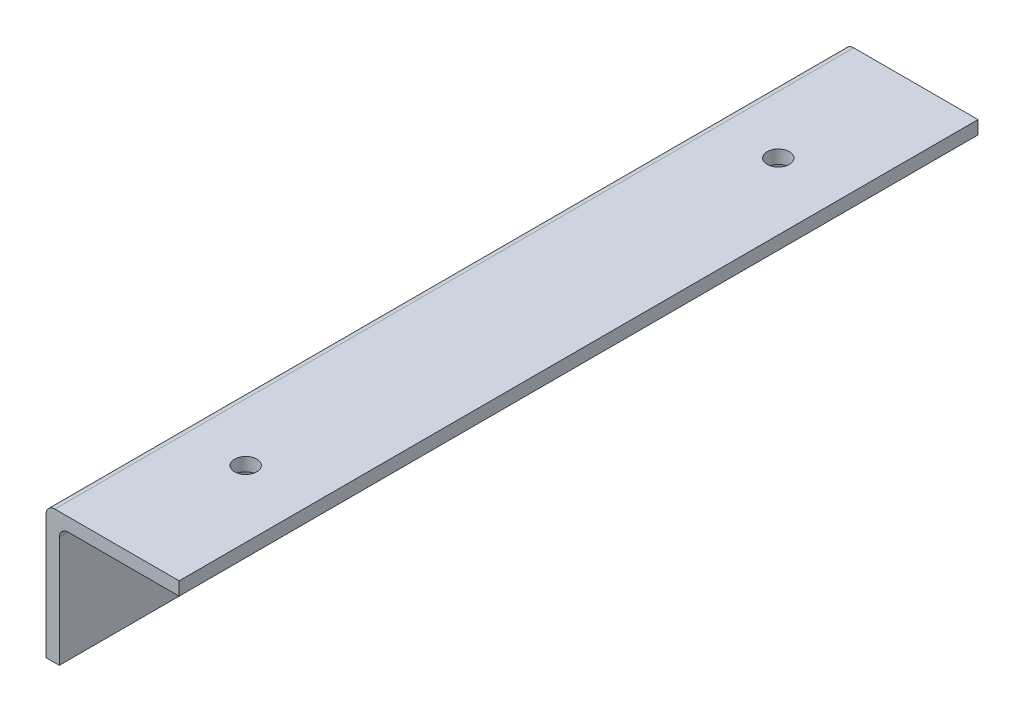
ISO-10303-21;
HEADER;
FILE_DESCRIPTION(('STEP AP214'),'2;1');
FILE_NAME('part.step','',(''),(''),'','','');
FILE_SCHEMA(('AUTOMOTIVE_DESIGN { 1 0 10303 214 1 1 1 1 }'));
ENDSEC;
DATA;
#1=APPLICATION_CONTEXT('core data for automotive mechanical design processes');
#2=APPLICATION_PROTOCOL_DEFINITION('international standard','automotive_design',2000,#1);
#3=PRODUCT_CONTEXT('',#1,'mechanical');
#4=PRODUCT('Part','Part','',(#3));
#5=PRODUCT_RELATED_PRODUCT_CATEGORY('part','',(#4));
#6=PRODUCT_DEFINITION_FORMATION('','',#4);
#7=PRODUCT_DEFINITION_CONTEXT('part definition',#1,'design');
#8=PRODUCT_DEFINITION('design','',#6,#7);
#9=PRODUCT_DEFINITION_SHAPE('','',#8);
#10=(LENGTH_UNIT() NAMED_UNIT(*) SI_UNIT(.MILLI.,.METRE.));
#11=(NAMED_UNIT(*) PLANE_ANGLE_UNIT() SI_UNIT($,.RADIAN.));
#12=(NAMED_UNIT(*) SI_UNIT($,.STERADIAN.) SOLID_ANGLE_UNIT());
#13=UNCERTAINTY_MEASURE_WITH_UNIT(LENGTH_MEASURE(1.E-05),#10,'distance_accuracy_value','');
#14=(GEOMETRIC_REPRESENTATION_CONTEXT(3) GLOBAL_UNCERTAINTY_ASSIGNED_CONTEXT((#13)) GLOBAL_UNIT_ASSIGNED_CONTEXT((#10,
#11,#12)) REPRESENTATION_CONTEXT('',''));
#15=CARTESIAN_POINT('',(0.,0.,0.));
#16=DIRECTION('',(0.,0.,1.));
#17=DIRECTION('',(1.,0.,0.));
#18=AXIS2_PLACEMENT_3D('',#15,#16,#17);
#19=CARTESIAN_POINT('',(30.,0.,180.));
#20=DIRECTION('',(0.,-1.,0.));
#21=DIRECTION('',(1.,0.,0.));
#22=AXIS2_PLACEMENT_3D('',#19,#20,#21);
#23=PLANE('',#22);
#24=CARTESIAN_POINT('',(15.,0.,30.));
#25=DIRECTION('',(0.,-1.,0.));
#26=DIRECTION('',(1.,0.,0.));
#27=AXIS2_PLACEMENT_3D('',#24,#25,#26);
#28=CIRCLE('',#27,2.50000000000001);
#29=CARTESIAN_POINT('',(17.5,0.,30.));
#30=VERTEX_POINT('',#29);
#31=EDGE_CURVE('E232',#30,#30,#28,.T.);
#32=ORIENTED_EDGE('',*,*,#31,.T.);
#33=EDGE_LOOP('',(#32));
#34=FACE_BOUND('',#33,.T.);
#35=CARTESIAN_POINT('',(15.,0.,150.));
#36=DIRECTION('',(0.,-1.,0.));
#37=DIRECTION('',(1.,0.,0.));
#38=AXIS2_PLACEMENT_3D('',#35,#36,#37);
#39=CIRCLE('',#38,2.5);
#40=CARTESIAN_POINT('',(17.5,0.,150.));
#41=VERTEX_POINT('',#40);
#42=EDGE_CURVE('E236',#41,#41,#39,.T.);
#43=ORIENTED_EDGE('',*,*,#42,.T.);
#44=EDGE_LOOP('',(#43));
#45=FACE_BOUND('',#44,.T.);
#46=DIRECTION('',(-1.,0.,0.));
#47=VECTOR('',#46,1.);
#48=CARTESIAN_POINT('',(30.,0.,0.));
#49=LINE('',#48,#47);
#50=CARTESIAN_POINT('',(30.,0.,0.));
#51=VERTEX_POINT('',#50);
#52=CARTESIAN_POINT('',(2.,0.,0.));
#53=VERTEX_POINT('',#52);
#54=EDGE_CURVE('E134',#51,#53,#49,.T.);
#55=ORIENTED_EDGE('',*,*,#54,.T.);
#56=DIRECTION('',(0.,0.,-1.));
#57=VECTOR('',#56,1.);
#58=CARTESIAN_POINT('',(2.,0.,180.));
#59=LINE('',#58,#57);
#60=CARTESIAN_POINT('',(2.,0.,180.));
#61=VERTEX_POINT('',#60);
#62=EDGE_CURVE('E48',#53,#61,#59,.F.);
#63=ORIENTED_EDGE('',*,*,#62,.T.);
#64=DIRECTION('',(-1.,0.,0.));
#65=VECTOR('',#64,1.);
#66=CARTESIAN_POINT('',(30.,0.,180.));
#67=LINE('',#66,#65);
#68=CARTESIAN_POINT('',(30.,0.,180.));
#69=VERTEX_POINT('',#68);
#70=EDGE_CURVE('E110',#69,#61,#67,.T.);
#71=ORIENTED_EDGE('',*,*,#70,.F.);
#72=DIRECTION('',(0.,0.,-1.));
#73=VECTOR('',#72,1.);
#74=CARTESIAN_POINT('',(30.,0.,180.));
#75=LINE('',#74,#73);
#76=EDGE_CURVE('E133',#69,#51,#75,.T.);
#77=ORIENTED_EDGE('',*,*,#76,.T.);
#78=EDGE_LOOP('',(#55,#63,#71,#77));
#79=FACE_BOUND('',#78,.T.);
#80=ADVANCED_FACE('F33',(#34,#45,#79),#23,.F.);
#81=CARTESIAN_POINT('',(0.,0.,180.));
#82=DIRECTION('',(1.,0.,0.));
#83=DIRECTION('',(0.,0.,-1.));
#84=AXIS2_PLACEMENT_3D('',#81,#82,#83);
#85=PLANE('',#84);
#86=CARTESIAN_POINT('',(0.,-15.,150.));
#87=DIRECTION('',(1.,0.,0.));
#88=DIRECTION('',(0.,0.,-1.));
#89=AXIS2_PLACEMENT_3D('',#86,#87,#88);
#90=CIRCLE('',#89,2.99999999999999);
#91=CARTESIAN_POINT('',(0.,-15.,147.));
#92=VERTEX_POINT('',#91);
#93=EDGE_CURVE('E245',#92,#92,#90,.T.);
#94=ORIENTED_EDGE('',*,*,#93,.T.);
#95=EDGE_LOOP('',(#94));
#96=FACE_BOUND('',#95,.T.);
#97=CARTESIAN_POINT('',(0.,-15.,30.));
#98=DIRECTION('',(1.,0.,0.));
#99=DIRECTION('',(0.,0.,-1.));
#100=AXIS2_PLACEMENT_3D('',#97,#98,#99);
#101=CIRCLE('',#100,3.);
#102=CARTESIAN_POINT('',(0.,-15.,27.));
#103=VERTEX_POINT('',#102);
#104=EDGE_CURVE('E136',#103,#103,#101,.T.);
#105=ORIENTED_EDGE('',*,*,#104,.T.);
#106=EDGE_LOOP('',(#105));
#107=FACE_BOUND('',#106,.T.);
#108=DIRECTION('',(0.,-1.,0.));
#109=VECTOR('',#108,1.);
#110=CARTESIAN_POINT('',(0.,0.,180.));
#111=LINE('',#110,#109);
#112=CARTESIAN_POINT('',(0.,-2.,180.));
#113=VERTEX_POINT('',#112);
#114=CARTESIAN_POINT('',(0.,-30.,180.));
#115=VERTEX_POINT('',#114);
#116=EDGE_CURVE('E98',#113,#115,#111,.T.);
#117=ORIENTED_EDGE('',*,*,#116,.F.);
#118=DIRECTION('',(0.,0.,-1.));
#119=VECTOR('',#118,1.);
#120=CARTESIAN_POINT('',(0.,-2.,180.));
#121=LINE('',#120,#119);
#122=CARTESIAN_POINT('',(0.,-2.,0.));
#123=VERTEX_POINT('',#122);
#124=EDGE_CURVE('E157',#113,#123,#121,.T.);
#125=ORIENTED_EDGE('',*,*,#124,.T.);
#126=DIRECTION('',(0.,-1.,0.));
#127=VECTOR('',#126,1.);
#128=CARTESIAN_POINT('',(0.,0.,0.));
#129=LINE('',#128,#127);
#130=CARTESIAN_POINT('',(0.,-30.,0.));
#131=VERTEX_POINT('',#130);
#132=EDGE_CURVE('E115',#123,#131,#129,.T.);
#133=ORIENTED_EDGE('',*,*,#132,.T.);
#134=DIRECTION('',(0.,0.,-1.));
#135=VECTOR('',#134,1.);
#136=CARTESIAN_POINT('',(0.,-30.,180.));
#137=LINE('',#136,#135);
#138=EDGE_CURVE('E113',#115,#131,#137,.T.);
#139=ORIENTED_EDGE('',*,*,#138,.F.);
#140=EDGE_LOOP('',(#117,#125,#133,#139));
#141=FACE_BOUND('',#140,.T.);
#142=ADVANCED_FACE('F114',(#96,#107,#141),#85,.F.);
#143=CARTESIAN_POINT('',(0.,-30.,180.));
#144=DIRECTION('',(0.,1.,0.));
#145=DIRECTION('',(0.,0.,1.));
#146=AXIS2_PLACEMENT_3D('',#143,#144,#145);
#147=PLANE('',#146);
#148=DIRECTION('',(1.,0.,0.));
#149=VECTOR('',#148,1.);
#150=CARTESIAN_POINT('',(0.,-30.,0.));
#151=LINE('',#150,#149);
#152=CARTESIAN_POINT('',(3.,-30.,0.));
#153=VERTEX_POINT('',#152);
#154=EDGE_CURVE('E138',#131,#153,#151,.T.);
#155=ORIENTED_EDGE('',*,*,#154,.T.);
#156=DIRECTION('',(0.,0.,-1.));
#157=VECTOR('',#156,1.);
#158=CARTESIAN_POINT('',(3.,-30.,180.));
#159=LINE('',#158,#157);
#160=CARTESIAN_POINT('',(3.,-30.,180.));
#161=VERTEX_POINT('',#160);
#162=EDGE_CURVE('E119',#161,#153,#159,.T.);
#163=ORIENTED_EDGE('',*,*,#162,.F.);
#164=DIRECTION('',(1.,0.,0.));
#165=VECTOR('',#164,1.);
#166=CARTESIAN_POINT('',(0.,-30.,180.));
#167=LINE('',#166,#165);
#168=EDGE_CURVE('E103',#115,#161,#167,.T.);
#169=ORIENTED_EDGE('',*,*,#168,.F.);
#170=ORIENTED_EDGE('',*,*,#138,.T.);
#171=EDGE_LOOP('',(#155,#163,#169,#170));
#172=FACE_BOUND('',#171,.T.);
#173=ADVANCED_FACE('F121',(#172),#147,.F.);
#174=CARTESIAN_POINT('',(3.,-30.,180.));
#175=DIRECTION('',(-1.,0.,0.));
#176=DIRECTION('',(0.,0.,1.));
#177=AXIS2_PLACEMENT_3D('',#174,#175,#176);
#178=PLANE('',#177);
#179=CARTESIAN_POINT('',(3.,-15.,150.));
#180=DIRECTION('',(1.,0.,0.));
#181=DIRECTION('',(0.,0.,-1.));
#182=AXIS2_PLACEMENT_3D('',#179,#180,#181);
#183=CIRCLE('',#182,2.99999999999999);
#184=CARTESIAN_POINT('',(3.00000000000003,-15.,147.));
#185=VERTEX_POINT('',#184);
#186=EDGE_CURVE('E242',#185,#185,#183,.T.);
#187=ORIENTED_EDGE('',*,*,#186,.F.);
#188=EDGE_LOOP('',(#187));
#189=FACE_BOUND('',#188,.T.);
#190=CARTESIAN_POINT('',(3.,-15.,30.));
#191=DIRECTION('',(1.,0.,0.));
#192=DIRECTION('',(0.,0.,-1.));
#193=AXIS2_PLACEMENT_3D('',#190,#191,#192);
#194=CIRCLE('',#193,3.);
#195=CARTESIAN_POINT('',(3.00000000000003,-15.,27.));
#196=VERTEX_POINT('',#195);
#197=EDGE_CURVE('E248',#196,#196,#194,.T.);
#198=ORIENTED_EDGE('',*,*,#197,.F.);
#199=EDGE_LOOP('',(#198));
#200=FACE_BOUND('',#199,.T.);
#201=DIRECTION('',(0.,1.,0.));
#202=VECTOR('',#201,1.);
#203=CARTESIAN_POINT('',(3.,-30.,0.));
#204=LINE('',#203,#202);
#205=CARTESIAN_POINT('',(3.,-5.,0.));
#206=VERTEX_POINT('',#205);
#207=EDGE_CURVE('E140',#153,#206,#204,.T.);
#208=ORIENTED_EDGE('',*,*,#207,.T.);
#209=DIRECTION('',(0.,0.,-1.));
#210=VECTOR('',#209,1.);
#211=CARTESIAN_POINT('',(3.,-5.,180.));
#212=LINE('',#211,#210);
#213=CARTESIAN_POINT('',(3.,-5.,180.));
#214=VERTEX_POINT('',#213);
#215=EDGE_CURVE('E155',#206,#214,#212,.F.);
#216=ORIENTED_EDGE('',*,*,#215,.T.);
#217=DIRECTION('',(0.,1.,0.));
#218=VECTOR('',#217,1.);
#219=CARTESIAN_POINT('',(3.,-30.,180.));
#220=LINE('',#219,#218);
#221=EDGE_CURVE('E124',#161,#214,#220,.T.);
#222=ORIENTED_EDGE('',*,*,#221,.F.);
#223=ORIENTED_EDGE('',*,*,#162,.T.);
#224=EDGE_LOOP('',(#208,#216,#222,#223));
#225=FACE_BOUND('',#224,.T.);
#226=ADVANCED_FACE('F169',(#189,#200,#225),#178,.F.);
#227=CARTESIAN_POINT('',(3.,-3.,180.));
#228=DIRECTION('',(0.,1.,0.));
#229=DIRECTION('',(-1.,0.,0.));
#230=AXIS2_PLACEMENT_3D('',#227,#228,#229);
#231=PLANE('',#230);
#232=CARTESIAN_POINT('',(15.,-3.,30.));
#233=DIRECTION('',(0.,-1.,0.));
#234=DIRECTION('',(1.,0.,0.));
#235=AXIS2_PLACEMENT_3D('',#232,#233,#234);
#236=CIRCLE('',#235,2.50000000000001);
#237=CARTESIAN_POINT('',(17.5,-3.00000000000003,30.));
#238=VERTEX_POINT('',#237);
#239=EDGE_CURVE('E230',#238,#238,#236,.T.);
#240=ORIENTED_EDGE('',*,*,#239,.F.);
#241=EDGE_LOOP('',(#240));
#242=FACE_BOUND('',#241,.T.);
#243=CARTESIAN_POINT('',(15.,-3.,150.));
#244=DIRECTION('',(0.,-1.,0.));
#245=DIRECTION('',(1.,0.,0.));
#246=AXIS2_PLACEMENT_3D('',#243,#244,#245);
#247=CIRCLE('',#246,2.5);
#248=CARTESIAN_POINT('',(17.5,-3.00000000000003,150.));
#249=VERTEX_POINT('',#248);
#250=EDGE_CURVE('E233',#249,#249,#247,.T.);
#251=ORIENTED_EDGE('',*,*,#250,.F.);
#252=EDGE_LOOP('',(#251));
#253=FACE_BOUND('',#252,.T.);
#254=DIRECTION('',(1.,0.,0.));
#255=VECTOR('',#254,1.);
#256=CARTESIAN_POINT('',(3.,-3.,180.));
#257=LINE('',#256,#255);
#258=CARTESIAN_POINT('',(5.,-3.,180.));
#259=VERTEX_POINT('',#258);
#260=CARTESIAN_POINT('',(30.,-3.,180.));
#261=VERTEX_POINT('',#260);
#262=EDGE_CURVE('E126',#259,#261,#257,.T.);
#263=ORIENTED_EDGE('',*,*,#262,.F.);
#264=DIRECTION('',(0.,0.,-1.));
#265=VECTOR('',#264,1.);
#266=CARTESIAN_POINT('',(5.,-3.,0.));
#267=LINE('',#266,#265);
#268=CARTESIAN_POINT('',(5.,-3.,0.));
#269=VERTEX_POINT('',#268);
#270=EDGE_CURVE('E118',#259,#269,#267,.T.);
#271=ORIENTED_EDGE('',*,*,#270,.T.);
#272=DIRECTION('',(1.,0.,0.));
#273=VECTOR('',#272,1.);
#274=CARTESIAN_POINT('',(3.,-3.,0.));
#275=LINE('',#274,#273);
#276=CARTESIAN_POINT('',(30.,-3.,0.));
#277=VERTEX_POINT('',#276);
#278=EDGE_CURVE('E143',#269,#277,#275,.T.);
#279=ORIENTED_EDGE('',*,*,#278,.T.);
#280=DIRECTION('',(0.,0.,-1.));
#281=VECTOR('',#280,1.);
#282=CARTESIAN_POINT('',(30.,-3.,180.));
#283=LINE('',#282,#281);
#284=EDGE_CURVE('E149',#261,#277,#283,.T.);
#285=ORIENTED_EDGE('',*,*,#284,.F.);
#286=EDGE_LOOP('',(#263,#271,#279,#285));
#287=FACE_BOUND('',#286,.T.);
#288=ADVANCED_FACE('F175',(#242,#253,#287),#231,.F.);
#289=CARTESIAN_POINT('',(30.,-3.,180.));
#290=DIRECTION('',(-1.,0.,0.));
#291=DIRECTION('',(0.,0.,1.));
#292=AXIS2_PLACEMENT_3D('',#289,#290,#291);
#293=PLANE('',#292);
#294=DIRECTION('',(0.,1.,0.));
#295=VECTOR('',#294,1.);
#296=CARTESIAN_POINT('',(30.,-3.,0.));
#297=LINE('',#296,#295);
#298=EDGE_CURVE('E145',#277,#51,#297,.T.);
#299=ORIENTED_EDGE('',*,*,#298,.T.);
#300=ORIENTED_EDGE('',*,*,#76,.F.);
#301=DIRECTION('',(0.,1.,0.));
#302=VECTOR('',#301,1.);
#303=CARTESIAN_POINT('',(30.,-3.,180.));
#304=LINE('',#303,#302);
#305=EDGE_CURVE('E131',#261,#69,#304,.T.);
#306=ORIENTED_EDGE('',*,*,#305,.F.);
#307=ORIENTED_EDGE('',*,*,#284,.T.);
#308=EDGE_LOOP('',(#299,#300,#306,#307));
#309=FACE_BOUND('',#308,.T.);
#310=ADVANCED_FACE('F179',(#309),#293,.F.);
#311=CARTESIAN_POINT('',(0.,0.,180.));
#312=DIRECTION('',(0.,0.,1.));
#313=DIRECTION('',(1.,0.,0.));
#314=AXIS2_PLACEMENT_3D('',#311,#312,#313);
#315=PLANE('',#314);
#316=ORIENTED_EDGE('',*,*,#70,.T.);
#317=CARTESIAN_POINT('',(2.,-2.,180.));
#318=DIRECTION('',(0.,0.,1.));
#319=DIRECTION('',(1.,0.,0.));
#320=AXIS2_PLACEMENT_3D('',#317,#318,#319);
#321=CIRCLE('',#320,2.);
#322=EDGE_CURVE('E106',#61,#113,#321,.T.);
#323=ORIENTED_EDGE('',*,*,#322,.T.);
#324=ORIENTED_EDGE('',*,*,#116,.T.);
#325=ORIENTED_EDGE('',*,*,#168,.T.);
#326=ORIENTED_EDGE('',*,*,#221,.T.);
#327=CARTESIAN_POINT('',(5.,-5.,180.));
#328=DIRECTION('',(0.,0.,1.));
#329=DIRECTION('',(1.,0.,0.));
#330=AXIS2_PLACEMENT_3D('',#327,#328,#329);
#331=CIRCLE('',#330,2.);
#332=EDGE_CURVE('E11',#214,#259,#331,.F.);
#333=ORIENTED_EDGE('',*,*,#332,.T.);
#334=ORIENTED_EDGE('',*,*,#262,.T.);
#335=ORIENTED_EDGE('',*,*,#305,.T.);
#336=EDGE_LOOP('',(#316,#323,#324,#325,#326,#333,#334,#335));
#337=FACE_BOUND('',#336,.T.);
#338=ADVANCED_FACE('F100',(#337),#315,.T.);
#339=CARTESIAN_POINT('',(0.,0.,0.));
#340=DIRECTION('',(0.,0.,1.));
#341=DIRECTION('',(1.,0.,0.));
#342=AXIS2_PLACEMENT_3D('',#339,#340,#341);
#343=PLANE('',#342);
#344=ORIENTED_EDGE('',*,*,#132,.F.);
#345=CARTESIAN_POINT('',(2.,-2.,0.));
#346=DIRECTION('',(0.,0.,1.));
#347=DIRECTION('',(1.,0.,0.));
#348=AXIS2_PLACEMENT_3D('',#345,#346,#347);
#349=CIRCLE('',#348,2.);
#350=EDGE_CURVE('E56',#123,#53,#349,.F.);
#351=ORIENTED_EDGE('',*,*,#350,.T.);
#352=ORIENTED_EDGE('',*,*,#54,.F.);
#353=ORIENTED_EDGE('',*,*,#298,.F.);
#354=ORIENTED_EDGE('',*,*,#278,.F.);
#355=CARTESIAN_POINT('',(5.,-5.,0.));
#356=DIRECTION('',(0.,0.,1.));
#357=DIRECTION('',(1.,0.,0.));
#358=AXIS2_PLACEMENT_3D('',#355,#356,#357);
#359=CIRCLE('',#358,2.);
#360=EDGE_CURVE('E41',#269,#206,#359,.T.);
#361=ORIENTED_EDGE('',*,*,#360,.T.);
#362=ORIENTED_EDGE('',*,*,#207,.F.);
#363=ORIENTED_EDGE('',*,*,#154,.F.);
#364=EDGE_LOOP('',(#344,#351,#352,#353,#354,#361,#362,#363));
#365=FACE_BOUND('',#364,.T.);
#366=ADVANCED_FACE('F163',(#365),#343,.F.);
#367=CARTESIAN_POINT('',(-177.,-15.,30.));
#368=DIRECTION('',(1.,0.,0.));
#369=DIRECTION('',(0.,0.,-1.));
#370=AXIS2_PLACEMENT_3D('',#367,#368,#369);
#371=CYLINDRICAL_SURFACE('',#370,3.);
#372=CARTESIAN_POINT('',(3.00000000000003,-15.,27.));
#373=CARTESIAN_POINT('',(2.96875000000003,-15.,27.));
#374=CARTESIAN_POINT('',(2.93750000000003,-15.,27.));
#375=CARTESIAN_POINT('',(2.87500000000003,-15.,27.));
#376=CARTESIAN_POINT('',(2.84375000000002,-15.,27.));
#377=CARTESIAN_POINT('',(2.78125000000002,-15.,27.));
#378=CARTESIAN_POINT('',(2.75000000000002,-15.,27.));
#379=CARTESIAN_POINT('',(2.68750000000002,-15.,27.));
#380=CARTESIAN_POINT('',(2.65625000000002,-15.,27.));
#381=CARTESIAN_POINT('',(2.59375000000002,-15.,27.));
#382=CARTESIAN_POINT('',(2.56250000000001,-15.,27.));
#383=CARTESIAN_POINT('',(2.50000000000001,-15.,27.));
#384=CARTESIAN_POINT('',(2.46875000000001,-15.,27.));
#385=CARTESIAN_POINT('',(2.40625000000001,-15.,27.));
#386=CARTESIAN_POINT('',(2.37500000000001,-15.,27.));
#387=CARTESIAN_POINT('',(2.3125,-15.,27.));
#388=CARTESIAN_POINT('',(2.28125,-15.,27.));
#389=CARTESIAN_POINT('',(2.21875000000001,-15.,27.));
#390=CARTESIAN_POINT('',(2.18750000000002,-15.,27.));
#391=CARTESIAN_POINT('',(2.12500000000002,-15.,27.));
#392=CARTESIAN_POINT('',(2.09375000000002,-15.,27.));
#393=CARTESIAN_POINT('',(2.03125000000002,-15.,27.));
#394=CARTESIAN_POINT('',(2.00000000000002,-15.,27.));
#395=CARTESIAN_POINT('',(1.93750000000002,-15.,27.));
#396=CARTESIAN_POINT('',(1.90625000000002,-15.,27.));
#397=CARTESIAN_POINT('',(1.84375000000001,-15.,27.));
#398=CARTESIAN_POINT('',(1.81250000000001,-15.,27.));
#399=CARTESIAN_POINT('',(1.75000000000001,-15.,27.));
#400=CARTESIAN_POINT('',(1.71875000000001,-15.,27.));
#401=CARTESIAN_POINT('',(1.65625000000001,-15.,27.));
#402=CARTESIAN_POINT('',(1.62500000000001,-15.,27.));
#403=CARTESIAN_POINT('',(1.5625,-15.,27.));
#404=CARTESIAN_POINT('',(1.53125,-15.,27.));
#405=CARTESIAN_POINT('',(1.46875,-15.,27.));
#406=CARTESIAN_POINT('',(1.4375,-15.,27.));
#407=CARTESIAN_POINT('',(1.375,-15.,27.));
#408=CARTESIAN_POINT('',(1.34375,-15.,27.));
#409=CARTESIAN_POINT('',(1.28124999999999,-15.,27.));
#410=CARTESIAN_POINT('',(1.24999999999999,-15.,27.));
#411=CARTESIAN_POINT('',(1.18749999999999,-15.,27.));
#412=CARTESIAN_POINT('',(1.15624999999999,-15.,27.));
#413=CARTESIAN_POINT('',(1.09374999999999,-15.,27.));
#414=CARTESIAN_POINT('',(1.06249999999998,-15.,27.));
#415=CARTESIAN_POINT('',(0.999999999999982,-15.,27.));
#416=CARTESIAN_POINT('',(0.968749999999981,-15.,27.));
#417=CARTESIAN_POINT('',(0.906249999999979,-15.,27.));
#418=CARTESIAN_POINT('',(0.874999999999978,-15.,27.));
#419=CARTESIAN_POINT('',(0.812499999999985,-15.,27.));
#420=CARTESIAN_POINT('',(0.781249999999993,-15.,27.));
#421=CARTESIAN_POINT('',(0.718749999999999,-15.,27.));
#422=CARTESIAN_POINT('',(0.687499999999998,-15.,27.));
#423=CARTESIAN_POINT('',(0.624999999999996,-15.,27.));
#424=CARTESIAN_POINT('',(0.593749999999995,-15.,27.));
#425=CARTESIAN_POINT('',(0.531249999999992,-15.,27.));
#426=CARTESIAN_POINT('',(0.499999999999991,-15.,27.));
#427=CARTESIAN_POINT('',(0.437499999999989,-15.,27.));
#428=CARTESIAN_POINT('',(0.406249999999988,-15.,27.));
#429=CARTESIAN_POINT('',(0.343749999999985,-15.,27.));
#430=CARTESIAN_POINT('',(0.312499999999984,-15.,27.));
#431=CARTESIAN_POINT('',(0.249999999999982,-15.,27.));
#432=CARTESIAN_POINT('',(0.218749999999981,-15.,27.));
#433=CARTESIAN_POINT('',(0.156249999999978,-15.,27.));
#434=CARTESIAN_POINT('',(0.124999999999977,-15.,27.));
#435=CARTESIAN_POINT('',(0.0624999999999746,-15.,27.));
#436=CARTESIAN_POINT('',(0.0312499999999734,-15.,27.));
#437=CARTESIAN_POINT('',(0.,-15.,27.));
#438=B_SPLINE_CURVE_WITH_KNOTS('',3,(#372,#373,#374,#375,#376,#377,#378,#379,#380,#381,#382,
#383,#384,#385,#386,#387,#388,#389,#390,#391,#392,#393,#394,#395,#396,#397,#398,#399,#400,#401,
#402,#403,#404,#405,#406,#407,#408,#409,#410,#411,#412,#413,#414,#415,#416,#417,#418,#419,#420,
#421,#422,#423,#424,#425,#426,#427,#428,#429,#430,#431,#432,#433,#434,#435,#436,#437),
.UNSPECIFIED.,.F.,.F.,(4,2,2,2,2,2,2,2,2,2,2,2,2,2,2,2,2,2,2,2,2,2,2,2,2,2,2,2,2,2,2,2,4),(0.,
0.0937500000000036,0.187500000000007,0.281250000000011,0.375000000000014,0.468750000000018,
0.562500000000021,0.656250000000025,0.750000000000028,0.843750000000004,0.937500000000008,
1.03125000000001,1.12500000000001,1.21875000000002,1.31250000000002,1.40625000000003,
1.50000000000003,1.59375000000003,1.68750000000004,1.78125000000004,1.87500000000004,
1.96875000000005,2.06250000000005,2.15625000000005,2.25000000000003,2.34375000000003,
2.43750000000004,2.53125000000004,2.62500000000004,2.71875000000005,2.81250000000005,
2.90625000000005,3.00000000000006),.UNSPECIFIED.);
#439=EDGE_CURVE('BSEAM209',#196,#103,#438,.T.);
#440=ORIENTED_EDGE('',*,*,#197,.T.);
#441=ORIENTED_EDGE('',*,*,#104,.F.);
#442=ORIENTED_EDGE('',*,*,#439,.T.);
#443=ORIENTED_EDGE('',*,*,#439,.F.);
#444=EDGE_LOOP('',(#440,#442,#441,#443));
#445=FACE_BOUND('',#444,.T.);
#446=ADVANCED_FACE('F209',(#445),#371,.F.);
#447=CARTESIAN_POINT('',(-177.,-15.,150.));
#448=DIRECTION('',(1.,0.,0.));
#449=DIRECTION('',(0.,0.,-1.));
#450=AXIS2_PLACEMENT_3D('',#447,#448,#449);
#451=CYLINDRICAL_SURFACE('',#450,2.99999999999999);
#452=CARTESIAN_POINT('',(3.00000000000003,-15.,147.));
#453=CARTESIAN_POINT('',(2.96875000000003,-15.,147.));
#454=CARTESIAN_POINT('',(2.93750000000003,-15.,147.));
#455=CARTESIAN_POINT('',(2.87500000000003,-15.,147.));
#456=CARTESIAN_POINT('',(2.84375000000002,-15.,147.));
#457=CARTESIAN_POINT('',(2.78125000000002,-15.,147.));
#458=CARTESIAN_POINT('',(2.75000000000002,-15.,147.));
#459=CARTESIAN_POINT('',(2.68750000000002,-15.,147.));
#460=CARTESIAN_POINT('',(2.65625000000002,-15.,147.));
#461=CARTESIAN_POINT('',(2.59375000000002,-15.,147.));
#462=CARTESIAN_POINT('',(2.56250000000001,-15.,147.));
#463=CARTESIAN_POINT('',(2.50000000000001,-15.,147.));
#464=CARTESIAN_POINT('',(2.46875000000001,-15.,147.));
#465=CARTESIAN_POINT('',(2.40625000000001,-15.,147.));
#466=CARTESIAN_POINT('',(2.37500000000001,-15.,147.));
#467=CARTESIAN_POINT('',(2.3125,-15.,147.));
#468=CARTESIAN_POINT('',(2.28125,-15.,147.));
#469=CARTESIAN_POINT('',(2.21875000000001,-15.,147.));
#470=CARTESIAN_POINT('',(2.18750000000002,-15.,147.));
#471=CARTESIAN_POINT('',(2.12500000000002,-15.,147.));
#472=CARTESIAN_POINT('',(2.09375000000002,-15.,147.));
#473=CARTESIAN_POINT('',(2.03125000000002,-15.,147.));
#474=CARTESIAN_POINT('',(2.00000000000002,-15.,147.));
#475=CARTESIAN_POINT('',(1.93750000000002,-15.,147.));
#476=CARTESIAN_POINT('',(1.90625000000002,-15.,147.));
#477=CARTESIAN_POINT('',(1.84375000000001,-15.,147.));
#478=CARTESIAN_POINT('',(1.81250000000001,-15.,147.));
#479=CARTESIAN_POINT('',(1.75000000000001,-15.,147.));
#480=CARTESIAN_POINT('',(1.71875000000001,-15.,147.));
#481=CARTESIAN_POINT('',(1.65625000000001,-15.,147.));
#482=CARTESIAN_POINT('',(1.62500000000001,-15.,147.));
#483=CARTESIAN_POINT('',(1.5625,-15.,147.));
#484=CARTESIAN_POINT('',(1.53125,-15.,147.));
#485=CARTESIAN_POINT('',(1.46875,-15.,147.));
#486=CARTESIAN_POINT('',(1.4375,-15.,147.));
#487=CARTESIAN_POINT('',(1.375,-15.,147.));
#488=CARTESIAN_POINT('',(1.34375,-15.,147.));
#489=CARTESIAN_POINT('',(1.28124999999999,-15.,147.));
#490=CARTESIAN_POINT('',(1.24999999999999,-15.,147.));
#491=CARTESIAN_POINT('',(1.18749999999999,-15.,147.));
#492=CARTESIAN_POINT('',(1.15624999999999,-15.,147.));
#493=CARTESIAN_POINT('',(1.09374999999999,-15.,147.));
#494=CARTESIAN_POINT('',(1.06249999999998,-15.,147.));
#495=CARTESIAN_POINT('',(0.999999999999982,-15.,147.));
#496=CARTESIAN_POINT('',(0.968749999999981,-15.,147.));
#497=CARTESIAN_POINT('',(0.906249999999979,-15.,147.));
#498=CARTESIAN_POINT('',(0.874999999999978,-15.,147.));
#499=CARTESIAN_POINT('',(0.812499999999985,-15.,147.));
#500=CARTESIAN_POINT('',(0.781249999999993,-15.,147.));
#501=CARTESIAN_POINT('',(0.718749999999999,-15.,147.));
#502=CARTESIAN_POINT('',(0.687499999999998,-15.,147.));
#503=CARTESIAN_POINT('',(0.624999999999996,-15.,147.));
#504=CARTESIAN_POINT('',(0.593749999999995,-15.,147.));
#505=CARTESIAN_POINT('',(0.531249999999992,-15.,147.));
#506=CARTESIAN_POINT('',(0.499999999999991,-15.,147.));
#507=CARTESIAN_POINT('',(0.437499999999989,-15.,147.));
#508=CARTESIAN_POINT('',(0.406249999999988,-15.,147.));
#509=CARTESIAN_POINT('',(0.343749999999985,-15.,147.));
#510=CARTESIAN_POINT('',(0.312499999999984,-15.,147.));
#511=CARTESIAN_POINT('',(0.249999999999982,-15.,147.));
#512=CARTESIAN_POINT('',(0.218749999999981,-15.,147.));
#513=CARTESIAN_POINT('',(0.156249999999978,-15.,147.));
#514=CARTESIAN_POINT('',(0.124999999999977,-15.,147.));
#515=CARTESIAN_POINT('',(0.0624999999999746,-15.,147.));
#516=CARTESIAN_POINT('',(0.0312499999999734,-15.,147.));
#517=CARTESIAN_POINT('',(0.,-15.,147.));
#518=B_SPLINE_CURVE_WITH_KNOTS('',3,(#452,#453,#454,#455,#456,#457,#458,#459,#460,#461,#462,
#463,#464,#465,#466,#467,#468,#469,#470,#471,#472,#473,#474,#475,#476,#477,#478,#479,#480,#481,
#482,#483,#484,#485,#486,#487,#488,#489,#490,#491,#492,#493,#494,#495,#496,#497,#498,#499,#500,
#501,#502,#503,#504,#505,#506,#507,#508,#509,#510,#511,#512,#513,#514,#515,#516,#517),
.UNSPECIFIED.,.F.,.F.,(4,2,2,2,2,2,2,2,2,2,2,2,2,2,2,2,2,2,2,2,2,2,2,2,2,2,2,2,2,2,2,2,4),(0.,
0.0937500000000036,0.187500000000007,0.281250000000011,0.375000000000014,0.468750000000018,
0.562500000000021,0.656250000000025,0.750000000000028,0.843750000000004,0.937500000000008,
1.03125000000001,1.12500000000001,1.21875000000002,1.31250000000002,1.40625000000003,
1.50000000000003,1.59375000000003,1.68750000000004,1.78125000000004,1.87500000000004,
1.96875000000005,2.06250000000005,2.15625000000005,2.25000000000003,2.34375000000003,
2.43750000000004,2.53125000000004,2.62500000000004,2.71875000000005,2.81250000000005,
2.90625000000005,3.00000000000006),.UNSPECIFIED.);
#519=EDGE_CURVE('BSEAM214',#185,#92,#518,.T.);
#520=ORIENTED_EDGE('',*,*,#186,.T.);
#521=ORIENTED_EDGE('',*,*,#93,.F.);
#522=ORIENTED_EDGE('',*,*,#519,.T.);
#523=ORIENTED_EDGE('',*,*,#519,.F.);
#524=EDGE_LOOP('',(#520,#522,#521,#523));
#525=FACE_BOUND('',#524,.T.);
#526=ADVANCED_FACE('F214',(#525),#451,.F.);
#527=CARTESIAN_POINT('',(15.,177.,150.));
#528=DIRECTION('',(0.,-1.,0.));
#529=DIRECTION('',(1.,0.,0.));
#530=AXIS2_PLACEMENT_3D('',#527,#528,#529);
#531=CYLINDRICAL_SURFACE('',#530,2.5);
#532=CARTESIAN_POINT('',(17.5,-3.00000000000003,150.));
#533=CARTESIAN_POINT('',(17.5,-2.96875000000003,150.));
#534=CARTESIAN_POINT('',(17.5,-2.93750000000003,150.));
#535=CARTESIAN_POINT('',(17.5,-2.87500000000003,150.));
#536=CARTESIAN_POINT('',(17.5,-2.84375000000002,150.));
#537=CARTESIAN_POINT('',(17.5,-2.78125000000002,150.));
#538=CARTESIAN_POINT('',(17.5,-2.75000000000002,150.));
#539=CARTESIAN_POINT('',(17.5,-2.68750000000002,150.));
#540=CARTESIAN_POINT('',(17.5,-2.65625000000002,150.));
#541=CARTESIAN_POINT('',(17.5,-2.59375000000002,150.));
#542=CARTESIAN_POINT('',(17.5,-2.56250000000001,150.));
#543=CARTESIAN_POINT('',(17.5,-2.50000000000001,150.));
#544=CARTESIAN_POINT('',(17.5,-2.46875000000001,150.));
#545=CARTESIAN_POINT('',(17.5,-2.40625000000001,150.));
#546=CARTESIAN_POINT('',(17.5,-2.37500000000001,150.));
#547=CARTESIAN_POINT('',(17.5,-2.3125,150.));
#548=CARTESIAN_POINT('',(17.5,-2.28125,150.));
#549=CARTESIAN_POINT('',(17.5,-2.21875000000001,150.));
#550=CARTESIAN_POINT('',(17.5,-2.18750000000002,150.));
#551=CARTESIAN_POINT('',(17.5,-2.12500000000002,150.));
#552=CARTESIAN_POINT('',(17.5,-2.09375000000002,150.));
#553=CARTESIAN_POINT('',(17.5,-2.03125000000002,150.));
#554=CARTESIAN_POINT('',(17.5,-2.00000000000002,150.));
#555=CARTESIAN_POINT('',(17.5,-1.93750000000002,150.));
#556=CARTESIAN_POINT('',(17.5,-1.90625000000002,150.));
#557=CARTESIAN_POINT('',(17.5,-1.84375000000001,150.));
#558=CARTESIAN_POINT('',(17.5,-1.81250000000001,150.));
#559=CARTESIAN_POINT('',(17.5,-1.75000000000001,150.));
#560=CARTESIAN_POINT('',(17.5,-1.71875000000001,150.));
#561=CARTESIAN_POINT('',(17.5,-1.65625000000001,150.));
#562=CARTESIAN_POINT('',(17.5,-1.62500000000001,150.));
#563=CARTESIAN_POINT('',(17.5,-1.5625,150.));
#564=CARTESIAN_POINT('',(17.5,-1.53125,150.));
#565=CARTESIAN_POINT('',(17.5,-1.46875,150.));
#566=CARTESIAN_POINT('',(17.5,-1.4375,150.));
#567=CARTESIAN_POINT('',(17.5,-1.375,150.));
#568=CARTESIAN_POINT('',(17.5,-1.34375,150.));
#569=CARTESIAN_POINT('',(17.5,-1.28124999999999,150.));
#570=CARTESIAN_POINT('',(17.5,-1.24999999999999,150.));
#571=CARTESIAN_POINT('',(17.5,-1.18749999999999,150.));
#572=CARTESIAN_POINT('',(17.5,-1.15624999999999,150.));
#573=CARTESIAN_POINT('',(17.5,-1.09374999999999,150.));
#574=CARTESIAN_POINT('',(17.5,-1.06249999999998,150.));
#575=CARTESIAN_POINT('',(17.5,-0.999999999999982,150.));
#576=CARTESIAN_POINT('',(17.5,-0.968749999999981,150.));
#577=CARTESIAN_POINT('',(17.5,-0.906249999999979,150.));
#578=CARTESIAN_POINT('',(17.5,-0.874999999999978,150.));
#579=CARTESIAN_POINT('',(17.5,-0.812499999999985,150.));
#580=CARTESIAN_POINT('',(17.5,-0.781249999999993,150.));
#581=CARTESIAN_POINT('',(17.5,-0.718749999999999,150.));
#582=CARTESIAN_POINT('',(17.5,-0.687499999999998,150.));
#583=CARTESIAN_POINT('',(17.5,-0.624999999999996,150.));
#584=CARTESIAN_POINT('',(17.5,-0.593749999999995,150.));
#585=CARTESIAN_POINT('',(17.5,-0.531249999999992,150.));
#586=CARTESIAN_POINT('',(17.5,-0.499999999999991,150.));
#587=CARTESIAN_POINT('',(17.5,-0.437499999999989,150.));
#588=CARTESIAN_POINT('',(17.5,-0.406249999999988,150.));
#589=CARTESIAN_POINT('',(17.5,-0.343749999999985,150.));
#590=CARTESIAN_POINT('',(17.5,-0.312499999999984,150.));
#591=CARTESIAN_POINT('',(17.5,-0.249999999999982,150.));
#592=CARTESIAN_POINT('',(17.5,-0.218749999999981,150.));
#593=CARTESIAN_POINT('',(17.5,-0.156249999999978,150.));
#594=CARTESIAN_POINT('',(17.5,-0.124999999999977,150.));
#595=CARTESIAN_POINT('',(17.5,-0.0624999999999746,150.));
#596=CARTESIAN_POINT('',(17.5,-0.0312499999999734,150.));
#597=CARTESIAN_POINT('',(17.5,0.,150.));
#598=B_SPLINE_CURVE_WITH_KNOTS('',3,(#532,#533,#534,#535,#536,#537,#538,#539,#540,#541,#542,
#543,#544,#545,#546,#547,#548,#549,#550,#551,#552,#553,#554,#555,#556,#557,#558,#559,#560,#561,
#562,#563,#564,#565,#566,#567,#568,#569,#570,#571,#572,#573,#574,#575,#576,#577,#578,#579,#580,
#581,#582,#583,#584,#585,#586,#587,#588,#589,#590,#591,#592,#593,#594,#595,#596,#597),
.UNSPECIFIED.,.F.,.F.,(4,2,2,2,2,2,2,2,2,2,2,2,2,2,2,2,2,2,2,2,2,2,2,2,2,2,2,2,2,2,2,2,4),(0.,
0.0937500000000036,0.187500000000007,0.281250000000011,0.375000000000014,0.468750000000018,
0.562500000000021,0.656250000000025,0.750000000000028,0.843750000000004,0.937500000000008,
1.03125000000001,1.12500000000001,1.21875000000002,1.31250000000002,1.40625000000003,
1.50000000000003,1.59375000000003,1.68750000000004,1.78125000000004,1.87500000000004,
1.96875000000005,2.06250000000005,2.15625000000005,2.25000000000003,2.34375000000003,
2.43750000000004,2.53125000000004,2.62500000000004,2.71875000000005,2.81250000000005,
2.90625000000005,3.00000000000006),.UNSPECIFIED.);
#599=EDGE_CURVE('BSEAM218',#249,#41,#598,.T.);
#600=ORIENTED_EDGE('',*,*,#250,.T.);
#601=ORIENTED_EDGE('',*,*,#42,.F.);
#602=ORIENTED_EDGE('',*,*,#599,.T.);
#603=ORIENTED_EDGE('',*,*,#599,.F.);
#604=EDGE_LOOP('',(#600,#602,#601,#603));
#605=FACE_BOUND('',#604,.T.);
#606=ADVANCED_FACE('F218',(#605),#531,.F.);
#607=CARTESIAN_POINT('',(15.,177.,30.));
#608=DIRECTION('',(0.,-1.,0.));
#609=DIRECTION('',(1.,0.,0.));
#610=AXIS2_PLACEMENT_3D('',#607,#608,#609);
#611=CYLINDRICAL_SURFACE('',#610,2.50000000000001);
#612=CARTESIAN_POINT('',(17.5,-3.00000000000003,30.));
#613=CARTESIAN_POINT('',(17.5,-2.96875000000003,30.));
#614=CARTESIAN_POINT('',(17.5,-2.93750000000003,30.));
#615=CARTESIAN_POINT('',(17.5,-2.87500000000003,30.));
#616=CARTESIAN_POINT('',(17.5,-2.84375000000002,30.));
#617=CARTESIAN_POINT('',(17.5,-2.78125000000002,30.));
#618=CARTESIAN_POINT('',(17.5,-2.75000000000002,30.));
#619=CARTESIAN_POINT('',(17.5,-2.68750000000002,30.));
#620=CARTESIAN_POINT('',(17.5,-2.65625000000002,30.));
#621=CARTESIAN_POINT('',(17.5,-2.59375000000002,30.));
#622=CARTESIAN_POINT('',(17.5,-2.56250000000001,30.));
#623=CARTESIAN_POINT('',(17.5,-2.50000000000001,30.));
#624=CARTESIAN_POINT('',(17.5,-2.46875000000001,30.));
#625=CARTESIAN_POINT('',(17.5,-2.40625000000001,30.));
#626=CARTESIAN_POINT('',(17.5,-2.37500000000001,30.));
#627=CARTESIAN_POINT('',(17.5,-2.3125,30.));
#628=CARTESIAN_POINT('',(17.5,-2.28125,30.));
#629=CARTESIAN_POINT('',(17.5,-2.21875000000001,30.));
#630=CARTESIAN_POINT('',(17.5,-2.18750000000002,30.));
#631=CARTESIAN_POINT('',(17.5,-2.12500000000002,30.));
#632=CARTESIAN_POINT('',(17.5,-2.09375000000002,30.));
#633=CARTESIAN_POINT('',(17.5,-2.03125000000002,30.));
#634=CARTESIAN_POINT('',(17.5,-2.00000000000002,30.));
#635=CARTESIAN_POINT('',(17.5,-1.93750000000002,30.));
#636=CARTESIAN_POINT('',(17.5,-1.90625000000002,30.));
#637=CARTESIAN_POINT('',(17.5,-1.84375000000001,30.));
#638=CARTESIAN_POINT('',(17.5,-1.81250000000001,30.));
#639=CARTESIAN_POINT('',(17.5,-1.75000000000001,30.));
#640=CARTESIAN_POINT('',(17.5,-1.71875000000001,30.));
#641=CARTESIAN_POINT('',(17.5,-1.65625000000001,30.));
#642=CARTESIAN_POINT('',(17.5,-1.62500000000001,30.));
#643=CARTESIAN_POINT('',(17.5,-1.5625,30.));
#644=CARTESIAN_POINT('',(17.5,-1.53125,30.));
#645=CARTESIAN_POINT('',(17.5,-1.46875,30.));
#646=CARTESIAN_POINT('',(17.5,-1.4375,30.));
#647=CARTESIAN_POINT('',(17.5,-1.375,30.));
#648=CARTESIAN_POINT('',(17.5,-1.34375,30.));
#649=CARTESIAN_POINT('',(17.5,-1.28124999999999,30.));
#650=CARTESIAN_POINT('',(17.5,-1.24999999999999,30.));
#651=CARTESIAN_POINT('',(17.5,-1.18749999999999,30.));
#652=CARTESIAN_POINT('',(17.5,-1.15624999999999,30.));
#653=CARTESIAN_POINT('',(17.5,-1.09374999999999,30.));
#654=CARTESIAN_POINT('',(17.5,-1.06249999999998,30.));
#655=CARTESIAN_POINT('',(17.5,-0.999999999999982,30.));
#656=CARTESIAN_POINT('',(17.5,-0.968749999999981,30.));
#657=CARTESIAN_POINT('',(17.5,-0.906249999999979,30.));
#658=CARTESIAN_POINT('',(17.5,-0.874999999999978,30.));
#659=CARTESIAN_POINT('',(17.5,-0.812499999999985,30.));
#660=CARTESIAN_POINT('',(17.5,-0.781249999999993,30.));
#661=CARTESIAN_POINT('',(17.5,-0.718749999999999,30.));
#662=CARTESIAN_POINT('',(17.5,-0.687499999999998,30.));
#663=CARTESIAN_POINT('',(17.5,-0.624999999999996,30.));
#664=CARTESIAN_POINT('',(17.5,-0.593749999999995,30.));
#665=CARTESIAN_POINT('',(17.5,-0.531249999999992,30.));
#666=CARTESIAN_POINT('',(17.5,-0.499999999999991,30.));
#667=CARTESIAN_POINT('',(17.5,-0.437499999999989,30.));
#668=CARTESIAN_POINT('',(17.5,-0.406249999999988,30.));
#669=CARTESIAN_POINT('',(17.5,-0.343749999999985,30.));
#670=CARTESIAN_POINT('',(17.5,-0.312499999999984,30.));
#671=CARTESIAN_POINT('',(17.5,-0.249999999999982,30.));
#672=CARTESIAN_POINT('',(17.5,-0.218749999999981,30.));
#673=CARTESIAN_POINT('',(17.5,-0.156249999999978,30.));
#674=CARTESIAN_POINT('',(17.5,-0.124999999999977,30.));
#675=CARTESIAN_POINT('',(17.5,-0.0624999999999746,30.));
#676=CARTESIAN_POINT('',(17.5,-0.0312499999999734,30.));
#677=CARTESIAN_POINT('',(17.5,0.,30.));
#678=B_SPLINE_CURVE_WITH_KNOTS('',3,(#612,#613,#614,#615,#616,#617,#618,#619,#620,#621,#622,
#623,#624,#625,#626,#627,#628,#629,#630,#631,#632,#633,#634,#635,#636,#637,#638,#639,#640,#641,
#642,#643,#644,#645,#646,#647,#648,#649,#650,#651,#652,#653,#654,#655,#656,#657,#658,#659,#660,
#661,#662,#663,#664,#665,#666,#667,#668,#669,#670,#671,#672,#673,#674,#675,#676,#677),
.UNSPECIFIED.,.F.,.F.,(4,2,2,2,2,2,2,2,2,2,2,2,2,2,2,2,2,2,2,2,2,2,2,2,2,2,2,2,2,2,2,2,4),(0.,
0.0937500000000036,0.187500000000007,0.281250000000011,0.375000000000014,0.468750000000018,
0.562500000000021,0.656250000000025,0.750000000000028,0.843750000000004,0.937500000000008,
1.03125000000001,1.12500000000001,1.21875000000002,1.31250000000002,1.40625000000003,
1.50000000000003,1.59375000000003,1.68750000000004,1.78125000000004,1.87500000000004,
1.96875000000005,2.06250000000005,2.15625000000005,2.25000000000003,2.34375000000003,
2.43750000000004,2.53125000000004,2.62500000000004,2.71875000000005,2.81250000000005,
2.90625000000005,3.00000000000006),.UNSPECIFIED.);
#679=EDGE_CURVE('BSEAM185',#238,#30,#678,.T.);
#680=ORIENTED_EDGE('',*,*,#239,.T.);
#681=ORIENTED_EDGE('',*,*,#31,.F.);
#682=ORIENTED_EDGE('',*,*,#679,.T.);
#683=ORIENTED_EDGE('',*,*,#679,.F.);
#684=EDGE_LOOP('',(#680,#682,#681,#683));
#685=FACE_BOUND('',#684,.T.);
#686=ADVANCED_FACE('F185',(#685),#611,.F.);
#687=CARTESIAN_POINT('',(5.,-5.,180.));
#688=DIRECTION('',(0.,0.,1.));
#689=DIRECTION('',(1.,0.,0.));
#690=AXIS2_PLACEMENT_3D('',#687,#688,#689);
#691=CYLINDRICAL_SURFACE('',#690,2.);
#692=ORIENTED_EDGE('',*,*,#332,.F.);
#693=ORIENTED_EDGE('',*,*,#215,.F.);
#694=ORIENTED_EDGE('',*,*,#360,.F.);
#695=ORIENTED_EDGE('',*,*,#270,.F.);
#696=EDGE_LOOP('',(#692,#693,#694,#695));
#697=FACE_BOUND('',#696,.T.);
#698=ADVANCED_FACE('F171',(#697),#691,.F.);
#699=CARTESIAN_POINT('',(2.,-2.,180.));
#700=DIRECTION('',(0.,0.,-1.));
#701=DIRECTION('',(-1.,0.,0.));
#702=AXIS2_PLACEMENT_3D('',#699,#700,#701);
#703=CYLINDRICAL_SURFACE('',#702,2.);
#704=ORIENTED_EDGE('',*,*,#322,.F.);
#705=ORIENTED_EDGE('',*,*,#62,.F.);
#706=ORIENTED_EDGE('',*,*,#350,.F.);
#707=ORIENTED_EDGE('',*,*,#124,.F.);
#708=EDGE_LOOP('',(#704,#705,#706,#707));
#709=FACE_BOUND('',#708,.T.);
#710=ADVANCED_FACE('F35',(#709),#703,.T.);
#711=CLOSED_SHELL('',(#80,#142,#173,#226,#288,#310,#338,#366,#446,#526,#606,#686,#698,#710));
#712=MANIFOLD_SOLID_BREP('B2',#711);
#713=ADVANCED_BREP_SHAPE_REPRESENTATION('',(#18,#712),#14);
#714=SHAPE_DEFINITION_REPRESENTATION(#9,#713);
ENDSEC;
END-ISO-10303-21;
